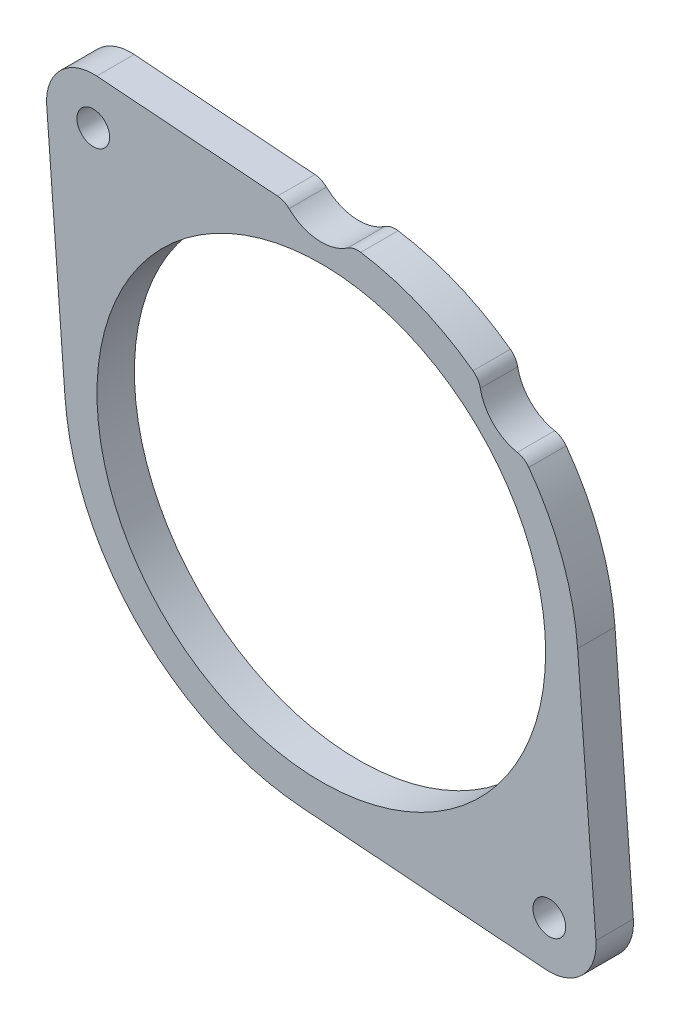
ISO-10303-21;
HEADER;
FILE_DESCRIPTION(('STEP AP214'),'2;1');
FILE_NAME('part.step','',(''),(''),'','','');
FILE_SCHEMA(('AUTOMOTIVE_DESIGN { 1 0 10303 214 1 1 1 1 }'));
ENDSEC;
DATA;
#1=APPLICATION_CONTEXT('core data for automotive mechanical design processes');
#2=APPLICATION_PROTOCOL_DEFINITION('international standard','automotive_design',2000,#1);
#3=PRODUCT_CONTEXT('',#1,'mechanical');
#4=PRODUCT('Part','Part','',(#3));
#5=PRODUCT_RELATED_PRODUCT_CATEGORY('part','',(#4));
#6=PRODUCT_DEFINITION_FORMATION('','',#4);
#7=PRODUCT_DEFINITION_CONTEXT('part definition',#1,'design');
#8=PRODUCT_DEFINITION('design','',#6,#7);
#9=PRODUCT_DEFINITION_SHAPE('','',#8);
#10=(LENGTH_UNIT() NAMED_UNIT(*) SI_UNIT(.MILLI.,.METRE.));
#11=(NAMED_UNIT(*) PLANE_ANGLE_UNIT() SI_UNIT($,.RADIAN.));
#12=(NAMED_UNIT(*) SI_UNIT($,.STERADIAN.) SOLID_ANGLE_UNIT());
#13=UNCERTAINTY_MEASURE_WITH_UNIT(LENGTH_MEASURE(1.E-05),#10,'distance_accuracy_value','');
#14=(GEOMETRIC_REPRESENTATION_CONTEXT(3) GLOBAL_UNCERTAINTY_ASSIGNED_CONTEXT((#13)) GLOBAL_UNIT_ASSIGNED_CONTEXT((#10,
#11,#12)) REPRESENTATION_CONTEXT('',''));
#15=CARTESIAN_POINT('',(0.,0.,0.));
#16=DIRECTION('',(0.,0.,1.));
#17=DIRECTION('',(1.,0.,0.));
#18=AXIS2_PLACEMENT_3D('',#15,#16,#17);
#19=CARTESIAN_POINT('',(20.5861280222966,15.0486322650805,0.));
#20=DIRECTION('',(0.,0.,1.));
#21=DIRECTION('',(1.,0.,0.));
#22=AXIS2_PLACEMENT_3D('',#19,#20,#21);
#23=CYLINDRICAL_SURFACE('',#22,1.99999999999986);
#24=CARTESIAN_POINT('',(20.5861280222966,15.0486322650805,0.));
#25=DIRECTION('',(0.,0.,1.));
#26=DIRECTION('',(1.,0.,0.));
#27=AXIS2_PLACEMENT_3D('',#24,#25,#26);
#28=CIRCLE('',#27,1.99999999999986);
#29=CARTESIAN_POINT('',(22.200726298555,16.2289171486162,0.));
#30=VERTEX_POINT('',#29);
#31=CARTESIAN_POINT('',(20.9673229350069,17.0119688227097,0.));
#32=VERTEX_POINT('',#31);
#33=EDGE_CURVE('E20',#30,#32,#28,.T.);
#34=ORIENTED_EDGE('',*,*,#33,.T.);
#35=DIRECTION('',(0.,0.,1.));
#36=VECTOR('',#35,1.);
#37=CARTESIAN_POINT('',(20.9673229350069,17.0119688227097,0.));
#38=LINE('',#37,#36);
#39=CARTESIAN_POINT('',(20.9673229350069,17.0119688227097,4.));
#40=VERTEX_POINT('',#39);
#41=EDGE_CURVE('E126',#32,#40,#38,.T.);
#42=ORIENTED_EDGE('',*,*,#41,.T.);
#43=CARTESIAN_POINT('',(20.5861280222966,15.0486322650805,4.));
#44=DIRECTION('',(0.,0.,1.));
#45=DIRECTION('',(1.,0.,0.));
#46=AXIS2_PLACEMENT_3D('',#43,#44,#45);
#47=CIRCLE('',#46,1.99999999999986);
#48=CARTESIAN_POINT('',(22.200726298555,16.2289171486162,4.));
#49=VERTEX_POINT('',#48);
#50=EDGE_CURVE('E203',#49,#40,#47,.T.);
#51=ORIENTED_EDGE('',*,*,#50,.F.);
#52=DIRECTION('',(0.,0.,1.));
#53=VECTOR('',#52,1.);
#54=CARTESIAN_POINT('',(22.200726298555,16.2289171486162,0.));
#55=LINE('',#54,#53);
#56=EDGE_CURVE('E128',#30,#49,#55,.T.);
#57=ORIENTED_EDGE('',*,*,#56,.F.);
#58=EDGE_LOOP('',(#34,#42,#51,#57));
#59=FACE_BOUND('',#58,.T.);
#60=ADVANCED_FACE('F17',(#59),#23,.T.);
#61=CARTESIAN_POINT('',(15.0486322650804,20.5861280222965,0.));
#62=DIRECTION('',(0.,0.,1.));
#63=DIRECTION('',(1.,0.,0.));
#64=AXIS2_PLACEMENT_3D('',#61,#62,#63);
#65=CYLINDRICAL_SURFACE('',#64,1.99999999999996);
#66=CARTESIAN_POINT('',(15.0486322650804,20.5861280222965,0.));
#67=DIRECTION('',(0.,0.,1.));
#68=DIRECTION('',(1.,0.,0.));
#69=AXIS2_PLACEMENT_3D('',#66,#67,#68);
#70=CIRCLE('',#69,1.99999999999996);
#71=CARTESIAN_POINT('',(17.0119688227097,20.9673229350069,0.));
#72=VERTEX_POINT('',#71);
#73=CARTESIAN_POINT('',(16.2289171486161,22.200726298555,0.));
#74=VERTEX_POINT('',#73);
#75=EDGE_CURVE('E130',#72,#74,#70,.T.);
#76=ORIENTED_EDGE('',*,*,#75,.T.);
#77=DIRECTION('',(0.,0.,1.));
#78=VECTOR('',#77,1.);
#79=CARTESIAN_POINT('',(16.2289171486161,22.200726298555,0.));
#80=LINE('',#79,#78);
#81=CARTESIAN_POINT('',(16.2289171486161,22.200726298555,4.));
#82=VERTEX_POINT('',#81);
#83=EDGE_CURVE('E183',#82,#74,#80,.F.);
#84=ORIENTED_EDGE('',*,*,#83,.F.);
#85=CARTESIAN_POINT('',(15.0486322650804,20.5861280222965,4.));
#86=DIRECTION('',(0.,0.,1.));
#87=DIRECTION('',(1.,0.,0.));
#88=AXIS2_PLACEMENT_3D('',#85,#86,#87);
#89=CIRCLE('',#88,1.99999999999996);
#90=CARTESIAN_POINT('',(17.0119688227097,20.9673229350069,4.));
#91=VERTEX_POINT('',#90);
#92=EDGE_CURVE('E201',#91,#82,#89,.T.);
#93=ORIENTED_EDGE('',*,*,#92,.F.);
#94=DIRECTION('',(0.,0.,1.));
#95=VECTOR('',#94,1.);
#96=CARTESIAN_POINT('',(17.0119688227097,20.9673229350069,0.));
#97=LINE('',#96,#95);
#98=EDGE_CURVE('E138',#91,#72,#97,.F.);
#99=ORIENTED_EDGE('',*,*,#98,.T.);
#100=EDGE_LOOP('',(#76,#84,#93,#99));
#101=FACE_BOUND('',#100,.T.);
#102=ADVANCED_FACE('F211',(#101),#65,.T.);
#103=CARTESIAN_POINT('',(3.91560080071923,25.1975806451613,0.));
#104=DIRECTION('',(0.,0.,1.));
#105=DIRECTION('',(1.,0.,0.));
#106=AXIS2_PLACEMENT_3D('',#103,#104,#105);
#107=CYLINDRICAL_SURFACE('',#106,2.00000000000001);
#108=CARTESIAN_POINT('',(3.91560080071923,25.1975806451613,0.));
#109=DIRECTION('',(0.,0.,1.));
#110=DIRECTION('',(1.,0.,0.));
#111=AXIS2_PLACEMENT_3D('',#108,#109,#110);
#112=CIRCLE('',#111,2.00000000000001);
#113=CARTESIAN_POINT('',(4.22270674587368,27.1738614800759,0.));
#114=VERTEX_POINT('',#113);
#115=CARTESIAN_POINT('',(2.79685771479945,26.8554147465438,0.));
#116=VERTEX_POINT('',#115);
#117=EDGE_CURVE('E207',#114,#116,#112,.T.);
#118=ORIENTED_EDGE('',*,*,#117,.T.);
#119=DIRECTION('',(0.,0.,1.));
#120=VECTOR('',#119,1.);
#121=CARTESIAN_POINT('',(2.79685771479945,26.8554147465438,0.));
#122=LINE('',#121,#120);
#123=CARTESIAN_POINT('',(2.79685771479945,26.8554147465438,4.));
#124=VERTEX_POINT('',#123);
#125=EDGE_CURVE('E179',#116,#124,#122,.T.);
#126=ORIENTED_EDGE('',*,*,#125,.T.);
#127=CARTESIAN_POINT('',(3.91560080071923,25.1975806451613,4.));
#128=DIRECTION('',(0.,0.,1.));
#129=DIRECTION('',(1.,0.,0.));
#130=AXIS2_PLACEMENT_3D('',#127,#128,#129);
#131=CIRCLE('',#130,2.00000000000001);
#132=CARTESIAN_POINT('',(4.22270674587368,27.1738614800759,4.));
#133=VERTEX_POINT('',#132);
#134=EDGE_CURVE('E199',#133,#124,#131,.T.);
#135=ORIENTED_EDGE('',*,*,#134,.F.);
#136=DIRECTION('',(0.,0.,1.));
#137=VECTOR('',#136,1.);
#138=CARTESIAN_POINT('',(4.22270674587368,27.1738614800759,0.));
#139=LINE('',#138,#137);
#140=EDGE_CURVE('E217',#114,#133,#139,.T.);
#141=ORIENTED_EDGE('',*,*,#140,.F.);
#142=EDGE_LOOP('',(#118,#126,#135,#141));
#143=FACE_BOUND('',#142,.T.);
#144=ADVANCED_FACE('F225',(#143),#107,.T.);
#145=CARTESIAN_POINT('',(-4.83129959830196,25.9345736416915,0.));
#146=DIRECTION('',(0.,0.,1.));
#147=DIRECTION('',(1.,0.,0.));
#148=AXIS2_PLACEMENT_3D('',#145,#146,#147);
#149=CYLINDRICAL_SURFACE('',#148,1.99999999999992);
#150=CARTESIAN_POINT('',(-4.83129959830196,25.9345736416915,0.));
#151=DIRECTION('',(0.,0.,1.));
#152=DIRECTION('',(1.,0.,0.));
#153=AXIS2_PLACEMENT_3D('',#150,#151,#152);
#154=CIRCLE('',#153,1.99999999999992);
#155=CARTESIAN_POINT('',(-3.45092828450143,27.3818383154939,0.));
#156=VERTEX_POINT('',#155);
#157=CARTESIAN_POINT('',(-4.68154079063765,27.9289588350598,0.));
#158=VERTEX_POINT('',#157);
#159=EDGE_CURVE('E205',#156,#158,#154,.T.);
#160=ORIENTED_EDGE('',*,*,#159,.T.);
#161=DIRECTION('',(0.,0.,1.));
#162=VECTOR('',#161,1.);
#163=CARTESIAN_POINT('',(-4.68154079063766,27.9289588350598,0.));
#164=LINE('',#163,#162);
#165=CARTESIAN_POINT('',(-4.68154079063765,27.9289588350598,4.));
#166=VERTEX_POINT('',#165);
#167=EDGE_CURVE('E174',#166,#158,#164,.F.);
#168=ORIENTED_EDGE('',*,*,#167,.F.);
#169=CARTESIAN_POINT('',(-4.83129959830196,25.9345736416915,4.));
#170=DIRECTION('',(0.,0.,1.));
#171=DIRECTION('',(1.,0.,0.));
#172=AXIS2_PLACEMENT_3D('',#169,#170,#171);
#173=CIRCLE('',#172,1.99999999999992);
#174=CARTESIAN_POINT('',(-3.45092828450143,27.3818383154939,4.));
#175=VERTEX_POINT('',#174);
#176=EDGE_CURVE('E197',#175,#166,#173,.T.);
#177=ORIENTED_EDGE('',*,*,#176,.F.);
#178=DIRECTION('',(0.,0.,1.));
#179=VECTOR('',#178,1.);
#180=CARTESIAN_POINT('',(-3.45092828450142,27.3818383154939,0.));
#181=LINE('',#180,#179);
#182=EDGE_CURVE('E226',#175,#156,#181,.F.);
#183=ORIENTED_EDGE('',*,*,#182,.T.);
#184=EDGE_LOOP('',(#160,#168,#177,#183));
#185=FACE_BOUND('',#184,.T.);
#186=ADVANCED_FACE('F306',(#185),#149,.T.);
#187=CARTESIAN_POINT('',(0.067693450900441,0.129960532722599,4.));
#188=DIRECTION('',(0.,0.,1.));
#189=DIRECTION('',(1.,0.,0.));
#190=AXIS2_PLACEMENT_3D('',#187,#188,#189);
#191=PLANE('',#190);
#192=CARTESIAN_POINT('',(-24.3951839509359,24.3951839509359,4.));
#193=DIRECTION('',(0.,0.,1.));
#194=DIRECTION('',(1.,0.,0.));
#195=AXIS2_PLACEMENT_3D('',#192,#193,#194);
#196=CIRCLE('',#195,1.75);
#197=CARTESIAN_POINT('',(-22.6451839509359,24.3951839509359,4.));
#198=VERTEX_POINT('',#197);
#199=EDGE_CURVE('E162',#198,#198,#196,.F.);
#200=ORIENTED_EDGE('',*,*,#199,.T.);
#201=EDGE_LOOP('',(#200));
#202=FACE_BOUND('',#201,.T.);
#203=CARTESIAN_POINT('',(24.3951839509359,-24.3951839509359,4.));
#204=DIRECTION('',(0.,0.,1.));
#205=DIRECTION('',(1.,0.,0.));
#206=AXIS2_PLACEMENT_3D('',#203,#204,#205);
#207=CIRCLE('',#206,1.75);
#208=CARTESIAN_POINT('',(26.1451839509359,-24.3951839509359,4.));
#209=VERTEX_POINT('',#208);
#210=EDGE_CURVE('E165',#209,#209,#207,.F.);
#211=ORIENTED_EDGE('',*,*,#210,.T.);
#212=EDGE_LOOP('',(#211));
#213=FACE_BOUND('',#212,.T.);
#214=CARTESIAN_POINT('',(0.,0.,4.));
#215=DIRECTION('',(0.,0.,1.));
#216=DIRECTION('',(1.,0.,0.));
#217=AXIS2_PLACEMENT_3D('',#214,#215,#216);
#218=CIRCLE('',#217,24.);
#219=CARTESIAN_POINT('',(24.,0.,4.));
#220=VERTEX_POINT('',#219);
#221=EDGE_CURVE('E168',#220,#220,#218,.F.);
#222=ORIENTED_EDGE('',*,*,#221,.T.);
#223=EDGE_LOOP('',(#222));
#224=FACE_BOUND('',#223,.T.);
#225=CARTESIAN_POINT('',(0.,31.,4.));
#226=DIRECTION('',(0.,0.,1.));
#227=DIRECTION('',(1.,0.,0.));
#228=AXIS2_PLACEMENT_3D('',#225,#226,#227);
#229=CIRCLE('',#228,5.);
#230=EDGE_CURVE('E175',#124,#175,#229,.F.);
#231=ORIENTED_EDGE('',*,*,#230,.T.);
#232=ORIENTED_EDGE('',*,*,#176,.T.);
#233=DIRECTION('',(-0.997192596684181,0.074879403832163,0.));
#234=VECTOR('',#233,1.);
#235=CARTESIAN_POINT('',(-24.0207869317751,29.3811469343568,4.));
#236=LINE('',#235,#234);
#237=CARTESIAN_POINT('',(-24.0207869317751,29.3811469343568,4.));
#238=VERTEX_POINT('',#237);
#239=EDGE_CURVE('E178',#238,#166,#236,.F.);
#240=ORIENTED_EDGE('',*,*,#239,.F.);
#241=CARTESIAN_POINT('',(-24.3951839509359,24.3951839509359,4.));
#242=DIRECTION('',(0.,0.,1.));
#243=DIRECTION('',(1.,0.,0.));
#244=AXIS2_PLACEMENT_3D('',#241,#242,#243);
#245=CIRCLE('',#244,5.);
#246=CARTESIAN_POINT('',(-29.3811469343568,24.0207869317751,4.));
#247=VERTEX_POINT('',#246);
#248=EDGE_CURVE('E172',#247,#238,#245,.F.);
#249=ORIENTED_EDGE('',*,*,#248,.F.);
#250=DIRECTION('',(0.074879403832163,-0.997192596684181,0.));
#251=VECTOR('',#250,1.);
#252=CARTESIAN_POINT('',(-27.422796408815,-2.05918360538448,4.));
#253=LINE('',#252,#251);
#254=CARTESIAN_POINT('',(-27.422796408815,-2.05918360538448,4.));
#255=VERTEX_POINT('',#254);
#256=EDGE_CURVE('E196',#255,#247,#253,.F.);
#257=ORIENTED_EDGE('',*,*,#256,.F.);
#258=CARTESIAN_POINT('',(0.,0.,4.));
#259=DIRECTION('',(0.,0.,1.));
#260=DIRECTION('',(1.,0.,0.));
#261=AXIS2_PLACEMENT_3D('',#258,#259,#260);
#262=CIRCLE('',#261,27.5);
#263=CARTESIAN_POINT('',(-2.05918360538447,-27.422796408815,4.));
#264=VERTEX_POINT('',#263);
#265=EDGE_CURVE('E193',#264,#255,#262,.F.);
#266=ORIENTED_EDGE('',*,*,#265,.F.);
#267=DIRECTION('',(0.997192596684181,-0.074879403832163,0.));
#268=VECTOR('',#267,1.);
#269=CARTESIAN_POINT('',(24.0207869317751,-29.3811469343568,4.));
#270=LINE('',#269,#268);
#271=CARTESIAN_POINT('',(24.0207869317751,-29.3811469343568,4.));
#272=VERTEX_POINT('',#271);
#273=EDGE_CURVE('E239',#272,#264,#270,.F.);
#274=ORIENTED_EDGE('',*,*,#273,.F.);
#275=CARTESIAN_POINT('',(24.3951839509359,-24.3951839509359,4.));
#276=DIRECTION('',(0.,0.,1.));
#277=DIRECTION('',(1.,0.,0.));
#278=AXIS2_PLACEMENT_3D('',#275,#276,#277);
#279=CIRCLE('',#278,5.);
#280=CARTESIAN_POINT('',(29.3811469343568,-24.0207869317751,4.));
#281=VERTEX_POINT('',#280);
#282=EDGE_CURVE('E189',#281,#272,#279,.F.);
#283=ORIENTED_EDGE('',*,*,#282,.F.);
#284=DIRECTION('',(-0.074879403832163,0.997192596684181,0.));
#285=VECTOR('',#284,1.);
#286=CARTESIAN_POINT('',(27.422796408815,2.05918360538448,4.));
#287=LINE('',#286,#285);
#288=CARTESIAN_POINT('',(27.422796408815,2.05918360538448,4.));
#289=VERTEX_POINT('',#288);
#290=EDGE_CURVE('E236',#289,#281,#287,.F.);
#291=ORIENTED_EDGE('',*,*,#290,.F.);
#292=CARTESIAN_POINT('',(0.,0.,4.));
#293=DIRECTION('',(0.,0.,1.));
#294=DIRECTION('',(1.,0.,0.));
#295=AXIS2_PLACEMENT_3D('',#292,#293,#294);
#296=CIRCLE('',#295,27.5);
#297=EDGE_CURVE('E185',#49,#289,#296,.F.);
#298=ORIENTED_EDGE('',*,*,#297,.F.);
#299=ORIENTED_EDGE('',*,*,#50,.T.);
#300=CARTESIAN_POINT('',(21.920310216783,21.920310216783,4.));
#301=DIRECTION('',(0.,0.,1.));
#302=DIRECTION('',(1.,0.,0.));
#303=AXIS2_PLACEMENT_3D('',#300,#301,#302);
#304=CIRCLE('',#303,5.);
#305=EDGE_CURVE('E137',#40,#91,#304,.F.);
#306=ORIENTED_EDGE('',*,*,#305,.T.);
#307=ORIENTED_EDGE('',*,*,#92,.T.);
#308=CARTESIAN_POINT('',(0.,0.,4.));
#309=DIRECTION('',(0.,0.,1.));
#310=DIRECTION('',(1.,0.,0.));
#311=AXIS2_PLACEMENT_3D('',#308,#309,#310);
#312=CIRCLE('',#311,27.5);
#313=EDGE_CURVE('E180',#133,#82,#312,.F.);
#314=ORIENTED_EDGE('',*,*,#313,.F.);
#315=ORIENTED_EDGE('',*,*,#134,.T.);
#316=EDGE_LOOP('',(#231,#232,#240,#249,#257,#266,#274,#283,#291,#298,#299,#306,#307,#314,#315));
#317=FACE_BOUND('',#316,.T.);
#318=ADVANCED_FACE('F272',(#202,#213,#224,#317),#191,.T.);
#319=CARTESIAN_POINT('',(-27.422796408815,-2.05918360538448,0.));
#320=DIRECTION('',(-0.997192596684181,-0.074879403832163,0.));
#321=DIRECTION('',(0.074879403832163,-0.997192596684181,0.));
#322=AXIS2_PLACEMENT_3D('',#319,#320,#321);
#323=PLANE('',#322);
#324=DIRECTION('',(0.0748794038321627,-0.997192596684181,0.));
#325=VECTOR('',#324,1.);
#326=CARTESIAN_POINT('',(-29.3811469343568,24.0207869317751,0.));
#327=LINE('',#326,#325);
#328=CARTESIAN_POINT('',(-29.3811469343568,24.0207869317751,0.));
#329=VERTEX_POINT('',#328);
#330=CARTESIAN_POINT('',(-27.422796408815,-2.05918360538447,0.));
#331=VERTEX_POINT('',#330);
#332=EDGE_CURVE('E161',#329,#331,#327,.T.);
#333=ORIENTED_EDGE('',*,*,#332,.T.);
#334=DIRECTION('',(0.,0.,1.));
#335=VECTOR('',#334,1.);
#336=CARTESIAN_POINT('',(-27.422796408815,-2.05918360538447,0.));
#337=LINE('',#336,#335);
#338=EDGE_CURVE('E195',#255,#331,#337,.F.);
#339=ORIENTED_EDGE('',*,*,#338,.F.);
#340=ORIENTED_EDGE('',*,*,#256,.T.);
#341=DIRECTION('',(0.,0.,1.));
#342=VECTOR('',#341,1.);
#343=CARTESIAN_POINT('',(-29.3811469343568,24.0207869317751,0.));
#344=LINE('',#343,#342);
#345=EDGE_CURVE('E171',#329,#247,#344,.T.);
#346=ORIENTED_EDGE('',*,*,#345,.F.);
#347=EDGE_LOOP('',(#333,#339,#340,#346));
#348=FACE_BOUND('',#347,.T.);
#349=ADVANCED_FACE('F301',(#348),#323,.T.);
#350=CARTESIAN_POINT('',(0.,0.,0.));
#351=DIRECTION('',(0.,0.,1.));
#352=DIRECTION('',(1.,0.,0.));
#353=AXIS2_PLACEMENT_3D('',#350,#351,#352);
#354=CYLINDRICAL_SURFACE('',#353,27.5);
#355=CARTESIAN_POINT('',(0.,0.,0.));
#356=DIRECTION('',(0.,0.,1.));
#357=DIRECTION('',(1.,0.,0.));
#358=AXIS2_PLACEMENT_3D('',#355,#356,#357);
#359=CIRCLE('',#358,27.5);
#360=CARTESIAN_POINT('',(-2.05918360538447,-27.422796408815,0.));
#361=VERTEX_POINT('',#360);
#362=EDGE_CURVE('E158',#331,#361,#359,.T.);
#363=ORIENTED_EDGE('',*,*,#362,.T.);
#364=DIRECTION('',(0.,0.,1.));
#365=VECTOR('',#364,1.);
#366=CARTESIAN_POINT('',(-2.05918360538447,-27.422796408815,0.));
#367=LINE('',#366,#365);
#368=EDGE_CURVE('E192',#264,#361,#367,.F.);
#369=ORIENTED_EDGE('',*,*,#368,.F.);
#370=ORIENTED_EDGE('',*,*,#265,.T.);
#371=ORIENTED_EDGE('',*,*,#338,.T.);
#372=EDGE_LOOP('',(#363,#369,#370,#371));
#373=FACE_BOUND('',#372,.T.);
#374=ADVANCED_FACE('F296',(#373),#354,.T.);
#375=CARTESIAN_POINT('',(24.0207869317751,-29.3811469343568,0.));
#376=DIRECTION('',(-0.074879403832163,-0.997192596684181,0.));
#377=DIRECTION('',(0.997192596684181,-0.074879403832163,0.));
#378=AXIS2_PLACEMENT_3D('',#375,#376,#377);
#379=PLANE('',#378);
#380=DIRECTION('',(0.997192596684181,-0.0748794038321625,0.));
#381=VECTOR('',#380,1.);
#382=CARTESIAN_POINT('',(-2.05918360538447,-27.422796408815,0.));
#383=LINE('',#382,#381);
#384=CARTESIAN_POINT('',(24.0207869317751,-29.3811469343568,0.));
#385=VERTEX_POINT('',#384);
#386=EDGE_CURVE('E157',#361,#385,#383,.T.);
#387=ORIENTED_EDGE('',*,*,#386,.T.);
#388=DIRECTION('',(0.,0.,1.));
#389=VECTOR('',#388,1.);
#390=CARTESIAN_POINT('',(24.0207869317751,-29.3811469343568,0.));
#391=LINE('',#390,#389);
#392=EDGE_CURVE('E191',#272,#385,#391,.F.);
#393=ORIENTED_EDGE('',*,*,#392,.F.);
#394=ORIENTED_EDGE('',*,*,#273,.T.);
#395=ORIENTED_EDGE('',*,*,#368,.T.);
#396=EDGE_LOOP('',(#387,#393,#394,#395));
#397=FACE_BOUND('',#396,.T.);
#398=ADVANCED_FACE('F292',(#397),#379,.T.);
#399=CARTESIAN_POINT('',(24.3951839509359,-24.3951839509359,0.));
#400=DIRECTION('',(0.,0.,1.));
#401=DIRECTION('',(1.,0.,0.));
#402=AXIS2_PLACEMENT_3D('',#399,#400,#401);
#403=CYLINDRICAL_SURFACE('',#402,5.);
#404=CARTESIAN_POINT('',(24.3951839509359,-24.3951839509359,0.));
#405=DIRECTION('',(0.,0.,1.));
#406=DIRECTION('',(1.,0.,0.));
#407=AXIS2_PLACEMENT_3D('',#404,#405,#406);
#408=CIRCLE('',#407,5.);
#409=CARTESIAN_POINT('',(29.3811469343568,-24.0207869317751,0.));
#410=VERTEX_POINT('',#409);
#411=EDGE_CURVE('E154',#385,#410,#408,.T.);
#412=ORIENTED_EDGE('',*,*,#411,.T.);
#413=DIRECTION('',(0.,0.,1.));
#414=VECTOR('',#413,1.);
#415=CARTESIAN_POINT('',(29.3811469343568,-24.0207869317751,0.));
#416=LINE('',#415,#414);
#417=EDGE_CURVE('E188',#281,#410,#416,.F.);
#418=ORIENTED_EDGE('',*,*,#417,.F.);
#419=ORIENTED_EDGE('',*,*,#282,.T.);
#420=ORIENTED_EDGE('',*,*,#392,.T.);
#421=EDGE_LOOP('',(#412,#418,#419,#420));
#422=FACE_BOUND('',#421,.T.);
#423=ADVANCED_FACE('F286',(#422),#403,.T.);
#424=CARTESIAN_POINT('',(27.422796408815,2.05918360538448,0.));
#425=DIRECTION('',(0.997192596684181,0.074879403832163,0.));
#426=DIRECTION('',(-0.074879403832163,0.997192596684181,0.));
#427=AXIS2_PLACEMENT_3D('',#424,#425,#426);
#428=PLANE('',#427);
#429=DIRECTION('',(-0.0748794038321633,0.997192596684181,0.));
#430=VECTOR('',#429,1.);
#431=CARTESIAN_POINT('',(29.3811469343568,-24.0207869317751,0.));
#432=LINE('',#431,#430);
#433=CARTESIAN_POINT('',(27.422796408815,2.05918360538449,0.));
#434=VERTEX_POINT('',#433);
#435=EDGE_CURVE('E150',#410,#434,#432,.T.);
#436=ORIENTED_EDGE('',*,*,#435,.T.);
#437=DIRECTION('',(0.,0.,1.));
#438=VECTOR('',#437,1.);
#439=CARTESIAN_POINT('',(27.422796408815,2.05918360538448,0.));
#440=LINE('',#439,#438);
#441=EDGE_CURVE('E187',#289,#434,#440,.F.);
#442=ORIENTED_EDGE('',*,*,#441,.F.);
#443=ORIENTED_EDGE('',*,*,#290,.T.);
#444=ORIENTED_EDGE('',*,*,#417,.T.);
#445=EDGE_LOOP('',(#436,#442,#443,#444));
#446=FACE_BOUND('',#445,.T.);
#447=ADVANCED_FACE('F282',(#446),#428,.T.);
#448=CARTESIAN_POINT('',(0.,0.,0.));
#449=DIRECTION('',(0.,0.,1.));
#450=DIRECTION('',(1.,0.,0.));
#451=AXIS2_PLACEMENT_3D('',#448,#449,#450);
#452=CYLINDRICAL_SURFACE('',#451,27.5);
#453=CARTESIAN_POINT('',(0.,0.,0.));
#454=DIRECTION('',(0.,0.,1.));
#455=DIRECTION('',(1.,0.,0.));
#456=AXIS2_PLACEMENT_3D('',#453,#454,#455);
#457=CIRCLE('',#456,27.5);
#458=EDGE_CURVE('E145',#434,#30,#457,.T.);
#459=ORIENTED_EDGE('',*,*,#458,.T.);
#460=ORIENTED_EDGE('',*,*,#56,.T.);
#461=ORIENTED_EDGE('',*,*,#297,.T.);
#462=ORIENTED_EDGE('',*,*,#441,.T.);
#463=EDGE_LOOP('',(#459,#460,#461,#462));
#464=FACE_BOUND('',#463,.T.);
#465=ADVANCED_FACE('F277',(#464),#452,.T.);
#466=CARTESIAN_POINT('',(21.920310216783,21.920310216783,0.));
#467=DIRECTION('',(0.,0.,1.));
#468=DIRECTION('',(1.,0.,0.));
#469=AXIS2_PLACEMENT_3D('',#466,#467,#468);
#470=CYLINDRICAL_SURFACE('',#469,5.);
#471=ORIENTED_EDGE('',*,*,#41,.F.);
#472=CARTESIAN_POINT('',(21.920310216783,21.920310216783,0.));
#473=DIRECTION('',(0.,0.,1.));
#474=DIRECTION('',(1.,0.,0.));
#475=AXIS2_PLACEMENT_3D('',#472,#473,#474);
#476=CIRCLE('',#475,5.);
#477=EDGE_CURVE('E135',#32,#72,#476,.F.);
#478=ORIENTED_EDGE('',*,*,#477,.T.);
#479=ORIENTED_EDGE('',*,*,#98,.F.);
#480=ORIENTED_EDGE('',*,*,#305,.F.);
#481=EDGE_LOOP('',(#471,#478,#479,#480));
#482=FACE_BOUND('',#481,.T.);
#483=ADVANCED_FACE('F134',(#482),#470,.F.);
#484=CARTESIAN_POINT('',(0.,0.,0.));
#485=DIRECTION('',(0.,0.,1.));
#486=DIRECTION('',(1.,0.,0.));
#487=AXIS2_PLACEMENT_3D('',#484,#485,#486);
#488=CYLINDRICAL_SURFACE('',#487,27.5);
#489=CARTESIAN_POINT('',(0.,0.,0.));
#490=DIRECTION('',(0.,0.,1.));
#491=DIRECTION('',(1.,0.,0.));
#492=AXIS2_PLACEMENT_3D('',#489,#490,#491);
#493=CIRCLE('',#492,27.5);
#494=EDGE_CURVE('E144',#74,#114,#493,.T.);
#495=ORIENTED_EDGE('',*,*,#494,.T.);
#496=ORIENTED_EDGE('',*,*,#140,.T.);
#497=ORIENTED_EDGE('',*,*,#313,.T.);
#498=ORIENTED_EDGE('',*,*,#83,.T.);
#499=EDGE_LOOP('',(#495,#496,#497,#498));
#500=FACE_BOUND('',#499,.T.);
#501=ADVANCED_FACE('F214',(#500),#488,.T.);
#502=CARTESIAN_POINT('',(0.,31.,0.));
#503=DIRECTION('',(0.,0.,1.));
#504=DIRECTION('',(1.,0.,0.));
#505=AXIS2_PLACEMENT_3D('',#502,#503,#504);
#506=CYLINDRICAL_SURFACE('',#505,5.);
#507=ORIENTED_EDGE('',*,*,#125,.F.);
#508=CARTESIAN_POINT('',(0.,31.,0.));
#509=DIRECTION('',(0.,0.,1.));
#510=DIRECTION('',(1.,0.,0.));
#511=AXIS2_PLACEMENT_3D('',#508,#509,#510);
#512=CIRCLE('',#511,5.);
#513=EDGE_CURVE('E148',#116,#156,#512,.F.);
#514=ORIENTED_EDGE('',*,*,#513,.T.);
#515=ORIENTED_EDGE('',*,*,#182,.F.);
#516=ORIENTED_EDGE('',*,*,#230,.F.);
#517=EDGE_LOOP('',(#507,#514,#515,#516));
#518=FACE_BOUND('',#517,.T.);
#519=ADVANCED_FACE('F269',(#518),#506,.F.);
#520=CARTESIAN_POINT('',(-24.0207869317751,29.3811469343568,0.));
#521=DIRECTION('',(0.074879403832163,0.997192596684181,0.));
#522=DIRECTION('',(-0.997192596684181,0.074879403832163,0.));
#523=AXIS2_PLACEMENT_3D('',#520,#521,#522);
#524=PLANE('',#523);
#525=DIRECTION('',(-0.997192596684181,0.0748794038321626,0.));
#526=VECTOR('',#525,1.);
#527=CARTESIAN_POINT('',(-4.68154079063766,27.9289588350598,0.));
#528=LINE('',#527,#526);
#529=CARTESIAN_POINT('',(-24.0207869317751,29.3811469343568,0.));
#530=VERTEX_POINT('',#529);
#531=EDGE_CURVE('E252',#158,#530,#528,.T.);
#532=ORIENTED_EDGE('',*,*,#531,.T.);
#533=DIRECTION('',(0.,0.,1.));
#534=VECTOR('',#533,1.);
#535=CARTESIAN_POINT('',(-24.0207869317751,29.3811469343568,0.));
#536=LINE('',#535,#534);
#537=EDGE_CURVE('E35',#238,#530,#536,.F.);
#538=ORIENTED_EDGE('',*,*,#537,.F.);
#539=ORIENTED_EDGE('',*,*,#239,.T.);
#540=ORIENTED_EDGE('',*,*,#167,.T.);
#541=EDGE_LOOP('',(#532,#538,#539,#540));
#542=FACE_BOUND('',#541,.T.);
#543=ADVANCED_FACE('F307',(#542),#524,.T.);
#544=CARTESIAN_POINT('',(-24.3951839509359,24.3951839509359,0.));
#545=DIRECTION('',(0.,0.,1.));
#546=DIRECTION('',(1.,0.,0.));
#547=AXIS2_PLACEMENT_3D('',#544,#545,#546);
#548=CYLINDRICAL_SURFACE('',#547,5.);
#549=CARTESIAN_POINT('',(-24.3951839509359,24.3951839509359,0.));
#550=DIRECTION('',(0.,0.,1.));
#551=DIRECTION('',(1.,0.,0.));
#552=AXIS2_PLACEMENT_3D('',#549,#550,#551);
#553=CIRCLE('',#552,5.);
#554=EDGE_CURVE('E251',#530,#329,#553,.T.);
#555=ORIENTED_EDGE('',*,*,#554,.T.);
#556=ORIENTED_EDGE('',*,*,#345,.T.);
#557=ORIENTED_EDGE('',*,*,#248,.T.);
#558=ORIENTED_EDGE('',*,*,#537,.T.);
#559=EDGE_LOOP('',(#555,#556,#557,#558));
#560=FACE_BOUND('',#559,.T.);
#561=ADVANCED_FACE('F303',(#560),#548,.T.);
#562=CARTESIAN_POINT('',(0.,0.,0.));
#563=DIRECTION('',(0.,0.,1.));
#564=DIRECTION('',(1.,0.,0.));
#565=AXIS2_PLACEMENT_3D('',#562,#563,#564);
#566=CYLINDRICAL_SURFACE('',#565,24.);
#567=CARTESIAN_POINT('',(0.,0.,0.));
#568=DIRECTION('',(0.,0.,1.));
#569=DIRECTION('',(1.,0.,0.));
#570=AXIS2_PLACEMENT_3D('',#567,#568,#569);
#571=CIRCLE('',#570,24.);
#572=CARTESIAN_POINT('',(24.,0.,0.));
#573=VERTEX_POINT('',#572);
#574=EDGE_CURVE('E248',#573,#573,#571,.F.);
#575=ORIENTED_EDGE('',*,*,#574,.T.);
#576=EDGE_LOOP('',(#575));
#577=FACE_BOUND('',#576,.T.);
#578=ORIENTED_EDGE('',*,*,#221,.F.);
#579=EDGE_LOOP('',(#578));
#580=FACE_BOUND('',#579,.T.);
#581=ADVANCED_FACE('F315',(#577,#580),#566,.F.);
#582=CARTESIAN_POINT('',(24.3951839509359,-24.3951839509359,0.));
#583=DIRECTION('',(0.,0.,1.));
#584=DIRECTION('',(1.,0.,0.));
#585=AXIS2_PLACEMENT_3D('',#582,#583,#584);
#586=CYLINDRICAL_SURFACE('',#585,1.75);
#587=CARTESIAN_POINT('',(24.3951839509359,-24.3951839509359,0.));
#588=DIRECTION('',(0.,0.,1.));
#589=DIRECTION('',(1.,0.,0.));
#590=AXIS2_PLACEMENT_3D('',#587,#588,#589);
#591=CIRCLE('',#590,1.75);
#592=CARTESIAN_POINT('',(26.1451839509359,-24.3951839509359,0.));
#593=VERTEX_POINT('',#592);
#594=EDGE_CURVE('E26',#593,#593,#591,.F.);
#595=ORIENTED_EDGE('',*,*,#594,.T.);
#596=EDGE_LOOP('',(#595));
#597=FACE_BOUND('',#596,.T.);
#598=ORIENTED_EDGE('',*,*,#210,.F.);
#599=EDGE_LOOP('',(#598));
#600=FACE_BOUND('',#599,.T.);
#601=ADVANCED_FACE('F325',(#597,#600),#586,.F.);
#602=CARTESIAN_POINT('',(-24.3951839509359,24.3951839509359,0.));
#603=DIRECTION('',(0.,0.,1.));
#604=DIRECTION('',(1.,0.,0.));
#605=AXIS2_PLACEMENT_3D('',#602,#603,#604);
#606=CYLINDRICAL_SURFACE('',#605,1.75);
#607=CARTESIAN_POINT('',(-24.3951839509359,24.3951839509359,0.));
#608=DIRECTION('',(0.,0.,1.));
#609=DIRECTION('',(1.,0.,0.));
#610=AXIS2_PLACEMENT_3D('',#607,#608,#609);
#611=CIRCLE('',#610,1.75);
#612=CARTESIAN_POINT('',(-22.6451839509359,24.3951839509359,0.));
#613=VERTEX_POINT('',#612);
#614=EDGE_CURVE('E11',#613,#613,#611,.F.);
#615=ORIENTED_EDGE('',*,*,#614,.T.);
#616=EDGE_LOOP('',(#615));
#617=FACE_BOUND('',#616,.T.);
#618=ORIENTED_EDGE('',*,*,#199,.F.);
#619=EDGE_LOOP('',(#618));
#620=FACE_BOUND('',#619,.T.);
#621=ADVANCED_FACE('F319',(#617,#620),#606,.F.);
#622=CARTESIAN_POINT('',(0.067693450900439,0.1299605327226,0.));
#623=DIRECTION('',(0.,0.,1.));
#624=DIRECTION('',(1.,0.,0.));
#625=AXIS2_PLACEMENT_3D('',#622,#623,#624);
#626=PLANE('',#625);
#627=ORIENTED_EDGE('',*,*,#614,.F.);
#628=EDGE_LOOP('',(#627));
#629=FACE_BOUND('',#628,.T.);
#630=ORIENTED_EDGE('',*,*,#594,.F.);
#631=EDGE_LOOP('',(#630));
#632=FACE_BOUND('',#631,.T.);
#633=ORIENTED_EDGE('',*,*,#574,.F.);
#634=EDGE_LOOP('',(#633));
#635=FACE_BOUND('',#634,.T.);
#636=ORIENTED_EDGE('',*,*,#531,.F.);
#637=ORIENTED_EDGE('',*,*,#159,.F.);
#638=ORIENTED_EDGE('',*,*,#513,.F.);
#639=ORIENTED_EDGE('',*,*,#117,.F.);
#640=ORIENTED_EDGE('',*,*,#494,.F.);
#641=ORIENTED_EDGE('',*,*,#75,.F.);
#642=ORIENTED_EDGE('',*,*,#477,.F.);
#643=ORIENTED_EDGE('',*,*,#33,.F.);
#644=ORIENTED_EDGE('',*,*,#458,.F.);
#645=ORIENTED_EDGE('',*,*,#435,.F.);
#646=ORIENTED_EDGE('',*,*,#411,.F.);
#647=ORIENTED_EDGE('',*,*,#386,.F.);
#648=ORIENTED_EDGE('',*,*,#362,.F.);
#649=ORIENTED_EDGE('',*,*,#332,.F.);
#650=ORIENTED_EDGE('',*,*,#554,.F.);
#651=EDGE_LOOP('',(#636,#637,#638,#639,#640,#641,#642,#643,#644,#645,#646,#647,#648,#649,#650));
#652=FACE_BOUND('',#651,.T.);
#653=ADVANCED_FACE('F141',(#629,#632,#635,#652),#626,.F.);
#654=CLOSED_SHELL('',(#60,#102,#144,#186,#318,#349,#374,#398,#423,#447,#465,#483,#501,#519,#543,
#561,#581,#601,#621,#653));
#655=MANIFOLD_SOLID_BREP('B1',#654);
#656=ADVANCED_BREP_SHAPE_REPRESENTATION('',(#18,#655),#14);
#657=SHAPE_DEFINITION_REPRESENTATION(#9,#656);
ENDSEC;
END-ISO-10303-21;
